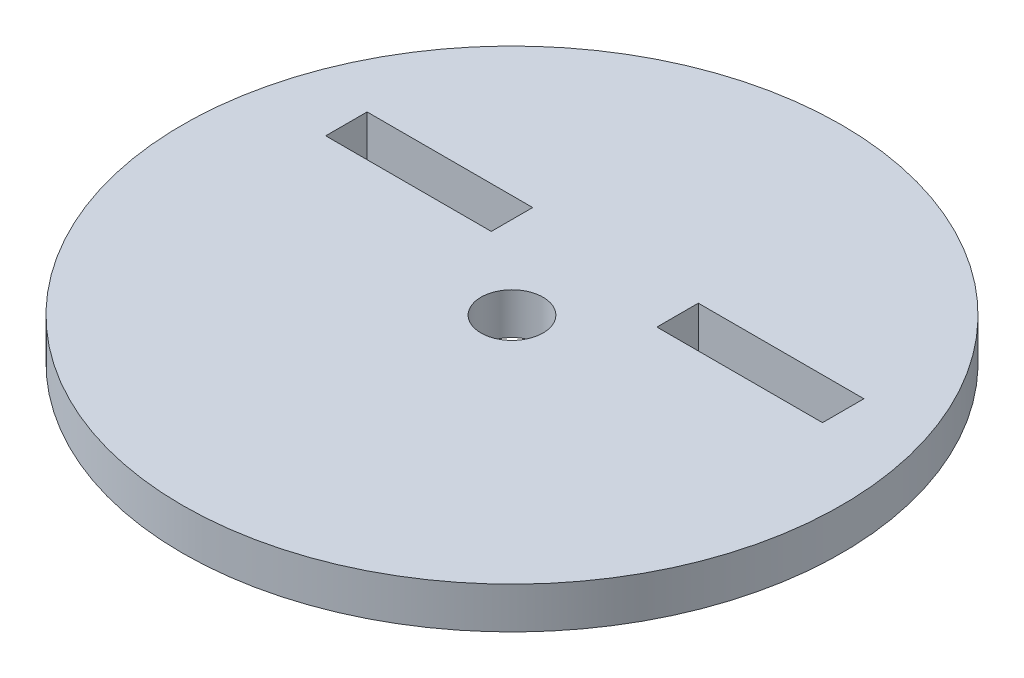
ISO-10303-21;
HEADER;
FILE_DESCRIPTION(('STEP AP214'),'2;1');
FILE_NAME('part.step','',(''),(''),'','','');
FILE_SCHEMA(('AUTOMOTIVE_DESIGN { 1 0 10303 214 1 1 1 1 }'));
ENDSEC;
DATA;
#1=APPLICATION_CONTEXT('core data for automotive mechanical design processes');
#2=APPLICATION_PROTOCOL_DEFINITION('international standard','automotive_design',2000,#1);
#3=PRODUCT_CONTEXT('',#1,'mechanical');
#4=PRODUCT('Part','Part','',(#3));
#5=PRODUCT_RELATED_PRODUCT_CATEGORY('part','',(#4));
#6=PRODUCT_DEFINITION_FORMATION('','',#4);
#7=PRODUCT_DEFINITION_CONTEXT('part definition',#1,'design');
#8=PRODUCT_DEFINITION('design','',#6,#7);
#9=PRODUCT_DEFINITION_SHAPE('','',#8);
#10=(LENGTH_UNIT() NAMED_UNIT(*) SI_UNIT(.MILLI.,.METRE.));
#11=(NAMED_UNIT(*) PLANE_ANGLE_UNIT() SI_UNIT($,.RADIAN.));
#12=(NAMED_UNIT(*) SI_UNIT($,.STERADIAN.) SOLID_ANGLE_UNIT());
#13=UNCERTAINTY_MEASURE_WITH_UNIT(LENGTH_MEASURE(1.E-05),#10,'distance_accuracy_value','');
#14=(GEOMETRIC_REPRESENTATION_CONTEXT(3) GLOBAL_UNCERTAINTY_ASSIGNED_CONTEXT((#13)) GLOBAL_UNIT_ASSIGNED_CONTEXT((#10,
#11,#12)) REPRESENTATION_CONTEXT('',''));
#15=CARTESIAN_POINT('',(0.,0.,0.));
#16=DIRECTION('',(0.,0.,1.));
#17=DIRECTION('',(1.,0.,0.));
#18=AXIS2_PLACEMENT_3D('',#15,#16,#17);
#19=CARTESIAN_POINT('',(0.,6.35,0.));
#20=DIRECTION('',(0.,1.,0.));
#21=DIRECTION('',(0.,0.,1.));
#22=AXIS2_PLACEMENT_3D('',#19,#20,#21);
#23=PLANE('',#22);
#24=CARTESIAN_POINT('',(0.,6.35,0.));
#25=DIRECTION('',(0.,1.,0.));
#26=DIRECTION('',(0.,0.,1.));
#27=AXIS2_PLACEMENT_3D('',#24,#25,#26);
#28=CIRCLE('',#27,50.546);
#29=CARTESIAN_POINT('',(0.,6.35,50.546));
#30=VERTEX_POINT('',#29);
#31=EDGE_CURVE('E11',#30,#30,#28,.T.);
#32=ORIENTED_EDGE('',*,*,#31,.T.);
#33=EDGE_LOOP('',(#32));
#34=FACE_BOUND('',#33,.T.);
#35=CARTESIAN_POINT('',(0.,6.35,0.));
#36=DIRECTION('',(0.,1.,0.));
#37=DIRECTION('',(0.,0.,1.));
#38=AXIS2_PLACEMENT_3D('',#35,#36,#37);
#39=CIRCLE('',#38,4.7625);
#40=CARTESIAN_POINT('',(0.,6.35,4.7625));
#41=VERTEX_POINT('',#40);
#42=EDGE_CURVE('E169',#41,#41,#39,.T.);
#43=ORIENTED_EDGE('',*,*,#42,.F.);
#44=EDGE_LOOP('',(#43));
#45=FACE_BOUND('',#44,.T.);
#46=DIRECTION('',(-1.,0.,0.));
#47=VECTOR('',#46,1.);
#48=CARTESIAN_POINT('',(-38.1,6.35,-15.875));
#49=LINE('',#48,#47);
#50=CARTESIAN_POINT('',(-12.7,6.35,-15.875));
#51=VERTEX_POINT('',#50);
#52=CARTESIAN_POINT('',(-38.1,6.35,-15.875));
#53=VERTEX_POINT('',#52);
#54=EDGE_CURVE('E140',#51,#53,#49,.T.);
#55=ORIENTED_EDGE('',*,*,#54,.F.);
#56=DIRECTION('',(0.,0.,-1.));
#57=VECTOR('',#56,1.);
#58=CARTESIAN_POINT('',(-12.7,6.35,-15.875));
#59=LINE('',#58,#57);
#60=CARTESIAN_POINT('',(-12.7,6.35,-9.525));
#61=VERTEX_POINT('',#60);
#62=EDGE_CURVE('E138',#61,#51,#59,.T.);
#63=ORIENTED_EDGE('',*,*,#62,.F.);
#64=DIRECTION('',(1.,0.,0.));
#65=VECTOR('',#64,1.);
#66=CARTESIAN_POINT('',(-38.1,6.35,-9.525));
#67=LINE('',#66,#65);
#68=CARTESIAN_POINT('',(-38.1,6.35,-9.525));
#69=VERTEX_POINT('',#68);
#70=EDGE_CURVE('E146',#69,#61,#67,.T.);
#71=ORIENTED_EDGE('',*,*,#70,.F.);
#72=DIRECTION('',(0.,0.,1.));
#73=VECTOR('',#72,1.);
#74=CARTESIAN_POINT('',(-38.1,6.35,-15.875));
#75=LINE('',#74,#73);
#76=EDGE_CURVE('E143',#53,#69,#75,.T.);
#77=ORIENTED_EDGE('',*,*,#76,.F.);
#78=EDGE_LOOP('',(#55,#63,#71,#77));
#79=FACE_BOUND('',#78,.T.);
#80=DIRECTION('',(0.,0.,1.));
#81=VECTOR('',#80,1.);
#82=CARTESIAN_POINT('',(12.7,6.35,-15.875));
#83=LINE('',#82,#81);
#84=CARTESIAN_POINT('',(12.7,6.35,-15.875));
#85=VERTEX_POINT('',#84);
#86=CARTESIAN_POINT('',(12.7,6.35,-9.525));
#87=VERTEX_POINT('',#86);
#88=EDGE_CURVE('E110',#85,#87,#83,.T.);
#89=ORIENTED_EDGE('',*,*,#88,.F.);
#90=DIRECTION('',(-1.,0.,0.));
#91=VECTOR('',#90,1.);
#92=CARTESIAN_POINT('',(38.1,6.35,-15.875));
#93=LINE('',#92,#91);
#94=CARTESIAN_POINT('',(38.1,6.35,-15.875));
#95=VERTEX_POINT('',#94);
#96=EDGE_CURVE('E102',#95,#85,#93,.T.);
#97=ORIENTED_EDGE('',*,*,#96,.F.);
#98=DIRECTION('',(0.,0.,-1.));
#99=VECTOR('',#98,1.);
#100=CARTESIAN_POINT('',(38.1,6.35,-15.875));
#101=LINE('',#100,#99);
#102=CARTESIAN_POINT('',(38.1,6.35,-9.525));
#103=VERTEX_POINT('',#102);
#104=EDGE_CURVE('E124',#103,#95,#101,.T.);
#105=ORIENTED_EDGE('',*,*,#104,.F.);
#106=DIRECTION('',(1.,0.,0.));
#107=VECTOR('',#106,1.);
#108=CARTESIAN_POINT('',(38.1,6.35,-9.525));
#109=LINE('',#108,#107);
#110=EDGE_CURVE('E122',#87,#103,#109,.T.);
#111=ORIENTED_EDGE('',*,*,#110,.F.);
#112=EDGE_LOOP('',(#89,#97,#105,#111));
#113=FACE_BOUND('',#112,.T.);
#114=ADVANCED_FACE('F37',(#34,#45,#79,#113),#23,.T.);
#115=CARTESIAN_POINT('',(0.,0.,0.));
#116=DIRECTION('',(0.,1.,0.));
#117=DIRECTION('',(0.,0.,1.));
#118=AXIS2_PLACEMENT_3D('',#115,#116,#117);
#119=PLANE('',#118);
#120=DIRECTION('',(0.,0.,-1.));
#121=VECTOR('',#120,1.);
#122=CARTESIAN_POINT('',(-12.7,0.,-15.875));
#123=LINE('',#122,#121);
#124=CARTESIAN_POINT('',(-12.7,0.,-9.525));
#125=VERTEX_POINT('',#124);
#126=CARTESIAN_POINT('',(-12.7,0.,-15.875));
#127=VERTEX_POINT('',#126);
#128=EDGE_CURVE('E118',#125,#127,#123,.T.);
#129=ORIENTED_EDGE('',*,*,#128,.T.);
#130=DIRECTION('',(-1.,0.,0.));
#131=VECTOR('',#130,1.);
#132=CARTESIAN_POINT('',(-38.1,0.,-15.875));
#133=LINE('',#132,#131);
#134=CARTESIAN_POINT('',(-38.1,0.,-15.875));
#135=VERTEX_POINT('',#134);
#136=EDGE_CURVE('E151',#127,#135,#133,.T.);
#137=ORIENTED_EDGE('',*,*,#136,.T.);
#138=DIRECTION('',(0.,0.,1.));
#139=VECTOR('',#138,1.);
#140=CARTESIAN_POINT('',(-38.1,0.,-15.875));
#141=LINE('',#140,#139);
#142=CARTESIAN_POINT('',(-38.1,0.,-9.525));
#143=VERTEX_POINT('',#142);
#144=EDGE_CURVE('E154',#135,#143,#141,.T.);
#145=ORIENTED_EDGE('',*,*,#144,.T.);
#146=DIRECTION('',(1.,0.,0.));
#147=VECTOR('',#146,1.);
#148=CARTESIAN_POINT('',(-38.1,0.,-9.525));
#149=LINE('',#148,#147);
#150=EDGE_CURVE('E141',#143,#125,#149,.T.);
#151=ORIENTED_EDGE('',*,*,#150,.T.);
#152=EDGE_LOOP('',(#129,#137,#145,#151));
#153=FACE_BOUND('',#152,.T.);
#154=CARTESIAN_POINT('',(0.,0.,0.));
#155=DIRECTION('',(0.,1.,0.));
#156=DIRECTION('',(0.,0.,1.));
#157=AXIS2_PLACEMENT_3D('',#154,#155,#156);
#158=CIRCLE('',#157,50.546);
#159=CARTESIAN_POINT('',(0.,0.,50.546));
#160=VERTEX_POINT('',#159);
#161=EDGE_CURVE('E41',#160,#160,#158,.T.);
#162=ORIENTED_EDGE('',*,*,#161,.F.);
#163=EDGE_LOOP('',(#162));
#164=FACE_BOUND('',#163,.T.);
#165=CARTESIAN_POINT('',(0.,0.,0.));
#166=DIRECTION('',(0.,1.,0.));
#167=DIRECTION('',(0.,0.,1.));
#168=AXIS2_PLACEMENT_3D('',#165,#166,#167);
#169=CIRCLE('',#168,4.7625);
#170=CARTESIAN_POINT('',(0.,0.,4.7625));
#171=VERTEX_POINT('',#170);
#172=EDGE_CURVE('E168',#171,#171,#169,.T.);
#173=ORIENTED_EDGE('',*,*,#172,.T.);
#174=EDGE_LOOP('',(#173));
#175=FACE_BOUND('',#174,.T.);
#176=DIRECTION('',(-1.,0.,0.));
#177=VECTOR('',#176,1.);
#178=CARTESIAN_POINT('',(38.1,0.,-15.875));
#179=LINE('',#178,#177);
#180=CARTESIAN_POINT('',(38.1,0.,-15.875));
#181=VERTEX_POINT('',#180);
#182=CARTESIAN_POINT('',(12.7,0.,-15.875));
#183=VERTEX_POINT('',#182);
#184=EDGE_CURVE('E60',#181,#183,#179,.T.);
#185=ORIENTED_EDGE('',*,*,#184,.T.);
#186=DIRECTION('',(0.,0.,1.));
#187=VECTOR('',#186,1.);
#188=CARTESIAN_POINT('',(12.7,0.,-15.875));
#189=LINE('',#188,#187);
#190=CARTESIAN_POINT('',(12.7,0.,-9.525));
#191=VERTEX_POINT('',#190);
#192=EDGE_CURVE('E117',#183,#191,#189,.T.);
#193=ORIENTED_EDGE('',*,*,#192,.T.);
#194=DIRECTION('',(1.,0.,0.));
#195=VECTOR('',#194,1.);
#196=CARTESIAN_POINT('',(38.1,0.,-9.525));
#197=LINE('',#196,#195);
#198=CARTESIAN_POINT('',(38.1,0.,-9.525));
#199=VERTEX_POINT('',#198);
#200=EDGE_CURVE('E130',#191,#199,#197,.T.);
#201=ORIENTED_EDGE('',*,*,#200,.T.);
#202=DIRECTION('',(0.,0.,-1.));
#203=VECTOR('',#202,1.);
#204=CARTESIAN_POINT('',(38.1,0.,-15.875));
#205=LINE('',#204,#203);
#206=EDGE_CURVE('E111',#199,#181,#205,.T.);
#207=ORIENTED_EDGE('',*,*,#206,.T.);
#208=EDGE_LOOP('',(#185,#193,#201,#207));
#209=FACE_BOUND('',#208,.T.);
#210=ADVANCED_FACE('F175',(#153,#164,#175,#209),#119,.F.);
#211=CARTESIAN_POINT('',(0.,6.35,0.));
#212=DIRECTION('',(0.,-1.,0.));
#213=DIRECTION('',(0.,0.,-1.));
#214=AXIS2_PLACEMENT_3D('',#211,#212,#213);
#215=CYLINDRICAL_SURFACE('',#214,50.546);
#216=ORIENTED_EDGE('',*,*,#31,.F.);
#217=EDGE_LOOP('',(#216));
#218=FACE_BOUND('',#217,.T.);
#219=ORIENTED_EDGE('',*,*,#161,.T.);
#220=EDGE_LOOP('',(#219));
#221=FACE_BOUND('',#220,.T.);
#222=ADVANCED_FACE('F39',(#218,#221),#215,.T.);
#223=CARTESIAN_POINT('',(0.,6.35,0.));
#224=DIRECTION('',(0.,-1.,0.));
#225=DIRECTION('',(0.,0.,-1.));
#226=AXIS2_PLACEMENT_3D('',#223,#224,#225);
#227=CYLINDRICAL_SURFACE('',#226,4.7625);
#228=ORIENTED_EDGE('',*,*,#42,.T.);
#229=EDGE_LOOP('',(#228));
#230=FACE_BOUND('',#229,.T.);
#231=ORIENTED_EDGE('',*,*,#172,.F.);
#232=EDGE_LOOP('',(#231));
#233=FACE_BOUND('',#232,.T.);
#234=ADVANCED_FACE('F178',(#230,#233),#227,.F.);
#235=CARTESIAN_POINT('',(-12.7,6.35,-15.875));
#236=DIRECTION('',(-1.,0.,0.));
#237=DIRECTION('',(0.,0.,1.));
#238=AXIS2_PLACEMENT_3D('',#235,#236,#237);
#239=PLANE('',#238);
#240=ORIENTED_EDGE('',*,*,#128,.F.);
#241=DIRECTION('',(0.,-1.,0.));
#242=VECTOR('',#241,1.);
#243=CARTESIAN_POINT('',(-12.7,6.35,-9.525));
#244=LINE('',#243,#242);
#245=EDGE_CURVE('E148',#61,#125,#244,.T.);
#246=ORIENTED_EDGE('',*,*,#245,.F.);
#247=ORIENTED_EDGE('',*,*,#62,.T.);
#248=DIRECTION('',(0.,-1.,0.));
#249=VECTOR('',#248,1.);
#250=CARTESIAN_POINT('',(-12.7,6.35,-15.875));
#251=LINE('',#250,#249);
#252=EDGE_CURVE('E165',#51,#127,#251,.T.);
#253=ORIENTED_EDGE('',*,*,#252,.T.);
#254=EDGE_LOOP('',(#240,#246,#247,#253));
#255=FACE_BOUND('',#254,.T.);
#256=ADVANCED_FACE('F180',(#255),#239,.T.);
#257=CARTESIAN_POINT('',(-38.1,6.35,-15.875));
#258=DIRECTION('',(0.,0.,1.));
#259=DIRECTION('',(1.,0.,0.));
#260=AXIS2_PLACEMENT_3D('',#257,#258,#259);
#261=PLANE('',#260);
#262=ORIENTED_EDGE('',*,*,#136,.F.);
#263=ORIENTED_EDGE('',*,*,#252,.F.);
#264=ORIENTED_EDGE('',*,*,#54,.T.);
#265=DIRECTION('',(0.,-1.,0.));
#266=VECTOR('',#265,1.);
#267=CARTESIAN_POINT('',(-38.1,6.35,-15.875));
#268=LINE('',#267,#266);
#269=EDGE_CURVE('E163',#53,#135,#268,.T.);
#270=ORIENTED_EDGE('',*,*,#269,.T.);
#271=EDGE_LOOP('',(#262,#263,#264,#270));
#272=FACE_BOUND('',#271,.T.);
#273=ADVANCED_FACE('F187',(#272),#261,.T.);
#274=CARTESIAN_POINT('',(-38.1,6.35,-15.875));
#275=DIRECTION('',(1.,0.,0.));
#276=DIRECTION('',(0.,0.,-1.));
#277=AXIS2_PLACEMENT_3D('',#274,#275,#276);
#278=PLANE('',#277);
#279=ORIENTED_EDGE('',*,*,#144,.F.);
#280=ORIENTED_EDGE('',*,*,#269,.F.);
#281=ORIENTED_EDGE('',*,*,#76,.T.);
#282=DIRECTION('',(0.,-1.,0.));
#283=VECTOR('',#282,1.);
#284=CARTESIAN_POINT('',(-38.1,6.35,-9.525));
#285=LINE('',#284,#283);
#286=EDGE_CURVE('E161',#69,#143,#285,.T.);
#287=ORIENTED_EDGE('',*,*,#286,.T.);
#288=EDGE_LOOP('',(#279,#280,#281,#287));
#289=FACE_BOUND('',#288,.T.);
#290=ADVANCED_FACE('F211',(#289),#278,.T.);
#291=CARTESIAN_POINT('',(-38.1,6.35,-9.525));
#292=DIRECTION('',(0.,0.,-1.));
#293=DIRECTION('',(-1.,0.,0.));
#294=AXIS2_PLACEMENT_3D('',#291,#292,#293);
#295=PLANE('',#294);
#296=ORIENTED_EDGE('',*,*,#150,.F.);
#297=ORIENTED_EDGE('',*,*,#286,.F.);
#298=ORIENTED_EDGE('',*,*,#70,.T.);
#299=ORIENTED_EDGE('',*,*,#245,.T.);
#300=EDGE_LOOP('',(#296,#297,#298,#299));
#301=FACE_BOUND('',#300,.T.);
#302=ADVANCED_FACE('F216',(#301),#295,.T.);
#303=CARTESIAN_POINT('',(38.1,6.35,-15.875));
#304=DIRECTION('',(0.,0.,1.));
#305=DIRECTION('',(1.,0.,0.));
#306=AXIS2_PLACEMENT_3D('',#303,#304,#305);
#307=PLANE('',#306);
#308=ORIENTED_EDGE('',*,*,#184,.F.);
#309=DIRECTION('',(0.,-1.,0.));
#310=VECTOR('',#309,1.);
#311=CARTESIAN_POINT('',(38.1,6.35,-15.875));
#312=LINE('',#311,#310);
#313=EDGE_CURVE('E106',#95,#181,#312,.T.);
#314=ORIENTED_EDGE('',*,*,#313,.F.);
#315=ORIENTED_EDGE('',*,*,#96,.T.);
#316=DIRECTION('',(0.,-1.,0.));
#317=VECTOR('',#316,1.);
#318=CARTESIAN_POINT('',(12.7,6.35,-15.875));
#319=LINE('',#318,#317);
#320=EDGE_CURVE('E105',#85,#183,#319,.T.);
#321=ORIENTED_EDGE('',*,*,#320,.T.);
#322=EDGE_LOOP('',(#308,#314,#315,#321));
#323=FACE_BOUND('',#322,.T.);
#324=ADVANCED_FACE('F104',(#323),#307,.T.);
#325=CARTESIAN_POINT('',(12.7,6.35,-15.875));
#326=DIRECTION('',(1.,0.,0.));
#327=DIRECTION('',(0.,0.,-1.));
#328=AXIS2_PLACEMENT_3D('',#325,#326,#327);
#329=PLANE('',#328);
#330=ORIENTED_EDGE('',*,*,#192,.F.);
#331=ORIENTED_EDGE('',*,*,#320,.F.);
#332=ORIENTED_EDGE('',*,*,#88,.T.);
#333=DIRECTION('',(0.,-1.,0.));
#334=VECTOR('',#333,1.);
#335=CARTESIAN_POINT('',(12.7,6.35,-9.525));
#336=LINE('',#335,#334);
#337=EDGE_CURVE('E119',#87,#191,#336,.T.);
#338=ORIENTED_EDGE('',*,*,#337,.T.);
#339=EDGE_LOOP('',(#330,#331,#332,#338));
#340=FACE_BOUND('',#339,.T.);
#341=ADVANCED_FACE('F114',(#340),#329,.T.);
#342=CARTESIAN_POINT('',(38.1,6.35,-9.525));
#343=DIRECTION('',(0.,0.,-1.));
#344=DIRECTION('',(-1.,0.,0.));
#345=AXIS2_PLACEMENT_3D('',#342,#343,#344);
#346=PLANE('',#345);
#347=ORIENTED_EDGE('',*,*,#200,.F.);
#348=ORIENTED_EDGE('',*,*,#337,.F.);
#349=ORIENTED_EDGE('',*,*,#110,.T.);
#350=DIRECTION('',(0.,-1.,0.));
#351=VECTOR('',#350,1.);
#352=CARTESIAN_POINT('',(38.1,6.35,-9.525));
#353=LINE('',#352,#351);
#354=EDGE_CURVE('E52',#103,#199,#353,.T.);
#355=ORIENTED_EDGE('',*,*,#354,.T.);
#356=EDGE_LOOP('',(#347,#348,#349,#355));
#357=FACE_BOUND('',#356,.T.);
#358=ADVANCED_FACE('F255',(#357),#346,.T.);
#359=CARTESIAN_POINT('',(38.1,6.35,-15.875));
#360=DIRECTION('',(-1.,0.,0.));
#361=DIRECTION('',(0.,0.,1.));
#362=AXIS2_PLACEMENT_3D('',#359,#360,#361);
#363=PLANE('',#362);
#364=ORIENTED_EDGE('',*,*,#206,.F.);
#365=ORIENTED_EDGE('',*,*,#354,.F.);
#366=ORIENTED_EDGE('',*,*,#104,.T.);
#367=ORIENTED_EDGE('',*,*,#313,.T.);
#368=EDGE_LOOP('',(#364,#365,#366,#367));
#369=FACE_BOUND('',#368,.T.);
#370=ADVANCED_FACE('F263',(#369),#363,.T.);
#371=CLOSED_SHELL('',(#114,#210,#222,#234,#256,#273,#290,#302,#324,#341,#358,#370));
#372=MANIFOLD_SOLID_BREP('B2',#371);
#373=ADVANCED_BREP_SHAPE_REPRESENTATION('',(#18,#372),#14);
#374=SHAPE_DEFINITION_REPRESENTATION(#9,#373);
ENDSEC;
END-ISO-10303-21;
